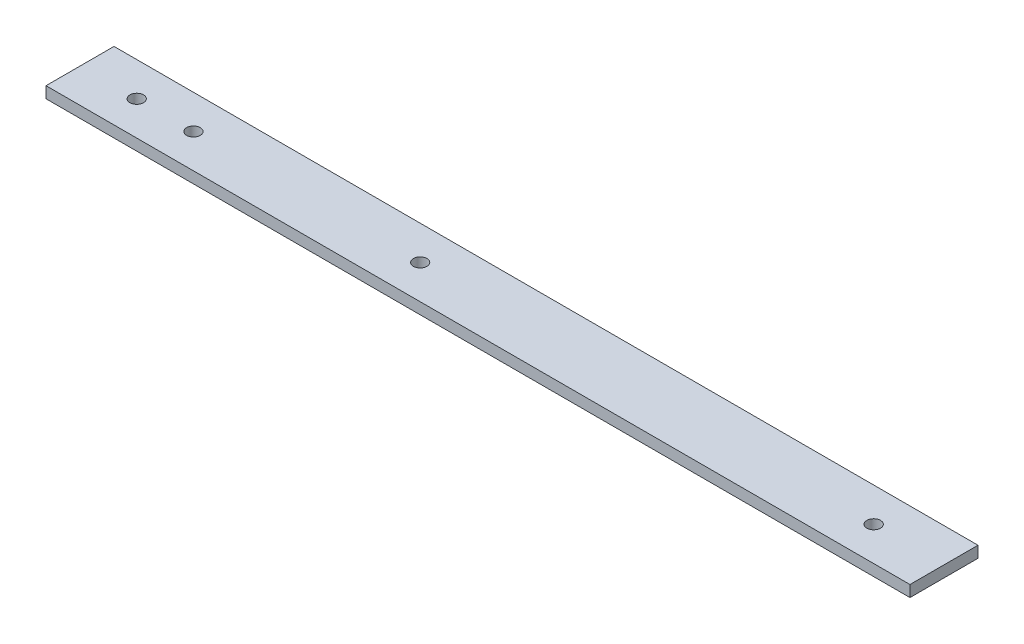
ISO-10303-21;
HEADER;
FILE_DESCRIPTION(('STEP AP214'),'2;1');
FILE_NAME('part.step','',(''),(''),'','','');
FILE_SCHEMA(('AUTOMOTIVE_DESIGN { 1 0 10303 214 1 1 1 1 }'));
ENDSEC;
DATA;
#1=APPLICATION_CONTEXT('core data for automotive mechanical design processes');
#2=APPLICATION_PROTOCOL_DEFINITION('international standard','automotive_design',2000,#1);
#3=PRODUCT_CONTEXT('',#1,'mechanical');
#4=PRODUCT('Part','Part','',(#3));
#5=PRODUCT_RELATED_PRODUCT_CATEGORY('part','',(#4));
#6=PRODUCT_DEFINITION_FORMATION('','',#4);
#7=PRODUCT_DEFINITION_CONTEXT('part definition',#1,'design');
#8=PRODUCT_DEFINITION('design','',#6,#7);
#9=PRODUCT_DEFINITION_SHAPE('','',#8);
#10=(LENGTH_UNIT() NAMED_UNIT(*) SI_UNIT(.MILLI.,.METRE.));
#11=(NAMED_UNIT(*) PLANE_ANGLE_UNIT() SI_UNIT($,.RADIAN.));
#12=(NAMED_UNIT(*) SI_UNIT($,.STERADIAN.) SOLID_ANGLE_UNIT());
#13=UNCERTAINTY_MEASURE_WITH_UNIT(LENGTH_MEASURE(1.E-05),#10,'distance_accuracy_value','');
#14=(GEOMETRIC_REPRESENTATION_CONTEXT(3) GLOBAL_UNCERTAINTY_ASSIGNED_CONTEXT((#13)) GLOBAL_UNIT_ASSIGNED_CONTEXT((#10,
#11,#12)) REPRESENTATION_CONTEXT('',''));
#15=CARTESIAN_POINT('',(0.,0.,0.));
#16=DIRECTION('',(0.,0.,1.));
#17=DIRECTION('',(1.,0.,0.));
#18=AXIS2_PLACEMENT_3D('',#15,#16,#17);
#19=CARTESIAN_POINT('',(0.,5.,0.));
#20=DIRECTION('',(0.,-1.,0.));
#21=DIRECTION('',(0.,0.,-1.));
#22=AXIS2_PLACEMENT_3D('',#19,#20,#21);
#23=PLANE('',#22);
#24=CARTESIAN_POINT('',(150.,5.,-15.));
#25=DIRECTION('',(0.,1.,0.));
#26=DIRECTION('',(0.,0.,1.));
#27=AXIS2_PLACEMENT_3D('',#24,#25,#26);
#28=CIRCLE('',#27,2.99999999999999);
#29=CARTESIAN_POINT('',(150.,5.,-12.));
#30=VERTEX_POINT('',#29);
#31=EDGE_CURVE('E121',#30,#30,#28,.T.);
#32=ORIENTED_EDGE('',*,*,#31,.F.);
#33=EDGE_LOOP('',(#32));
#34=FACE_BOUND('',#33,.T.);
#35=CARTESIAN_POINT('',(25.,5.,-15.));
#36=DIRECTION('',(0.,1.,0.));
#37=DIRECTION('',(0.,0.,1.));
#38=AXIS2_PLACEMENT_3D('',#35,#36,#37);
#39=CIRCLE('',#38,3.);
#40=CARTESIAN_POINT('',(25.,5.,-12.));
#41=VERTEX_POINT('',#40);
#42=EDGE_CURVE('E100',#41,#41,#39,.T.);
#43=ORIENTED_EDGE('',*,*,#42,.F.);
#44=EDGE_LOOP('',(#43));
#45=FACE_BOUND('',#44,.T.);
#46=DIRECTION('',(0.,0.,1.));
#47=VECTOR('',#46,1.);
#48=CARTESIAN_POINT('',(0.,5.,0.));
#49=LINE('',#48,#47);
#50=CARTESIAN_POINT('',(0.,5.,-30.));
#51=VERTEX_POINT('',#50);
#52=CARTESIAN_POINT('',(0.,5.,0.));
#53=VERTEX_POINT('',#52);
#54=EDGE_CURVE('E85',#51,#53,#49,.T.);
#55=ORIENTED_EDGE('',*,*,#54,.T.);
#56=DIRECTION('',(1.,0.,0.));
#57=VECTOR('',#56,1.);
#58=CARTESIAN_POINT('',(0.,5.,0.));
#59=LINE('',#58,#57);
#60=CARTESIAN_POINT('',(381.,5.,0.));
#61=VERTEX_POINT('',#60);
#62=EDGE_CURVE('E80',#53,#61,#59,.T.);
#63=ORIENTED_EDGE('',*,*,#62,.T.);
#64=DIRECTION('',(0.,0.,-1.));
#65=VECTOR('',#64,1.);
#66=CARTESIAN_POINT('',(381.,5.,0.));
#67=LINE('',#66,#65);
#68=CARTESIAN_POINT('',(381.,5.,-30.));
#69=VERTEX_POINT('',#68);
#70=EDGE_CURVE('E83',#61,#69,#67,.T.);
#71=ORIENTED_EDGE('',*,*,#70,.T.);
#72=DIRECTION('',(-1.,0.,0.));
#73=VECTOR('',#72,1.);
#74=CARTESIAN_POINT('',(0.,5.,-30.));
#75=LINE('',#74,#73);
#76=EDGE_CURVE('E50',#69,#51,#75,.T.);
#77=ORIENTED_EDGE('',*,*,#76,.T.);
#78=EDGE_LOOP('',(#55,#63,#71,#77));
#79=FACE_BOUND('',#78,.T.);
#80=CARTESIAN_POINT('',(50.,5.,-15.));
#81=DIRECTION('',(0.,1.,0.));
#82=DIRECTION('',(0.,0.,1.));
#83=AXIS2_PLACEMENT_3D('',#80,#81,#82);
#84=CIRCLE('',#83,3.);
#85=CARTESIAN_POINT('',(50.,5.,-12.));
#86=VERTEX_POINT('',#85);
#87=EDGE_CURVE('E115',#86,#86,#84,.T.);
#88=ORIENTED_EDGE('',*,*,#87,.F.);
#89=EDGE_LOOP('',(#88));
#90=FACE_BOUND('',#89,.T.);
#91=CARTESIAN_POINT('',(350.,5.,-15.));
#92=DIRECTION('',(0.,1.,0.));
#93=DIRECTION('',(0.,0.,1.));
#94=AXIS2_PLACEMENT_3D('',#91,#92,#93);
#95=CIRCLE('',#94,2.99999999999999);
#96=CARTESIAN_POINT('',(350.,5.,-12.));
#97=VERTEX_POINT('',#96);
#98=EDGE_CURVE('E127',#97,#97,#95,.T.);
#99=ORIENTED_EDGE('',*,*,#98,.F.);
#100=EDGE_LOOP('',(#99));
#101=FACE_BOUND('',#100,.T.);
#102=ADVANCED_FACE('F33',(#34,#45,#79,#90,#101),#23,.F.);
#103=CARTESIAN_POINT('',(0.,0.,0.));
#104=DIRECTION('',(0.,-1.,0.));
#105=DIRECTION('',(0.,0.,-1.));
#106=AXIS2_PLACEMENT_3D('',#103,#104,#105);
#107=PLANE('',#106);
#108=CARTESIAN_POINT('',(150.,0.,-15.));
#109=DIRECTION('',(0.,1.,0.));
#110=DIRECTION('',(0.,0.,1.));
#111=AXIS2_PLACEMENT_3D('',#108,#109,#110);
#112=CIRCLE('',#111,2.99999999999999);
#113=CARTESIAN_POINT('',(150.,0.,-12.));
#114=VERTEX_POINT('',#113);
#115=EDGE_CURVE('E124',#114,#114,#112,.T.);
#116=ORIENTED_EDGE('',*,*,#115,.T.);
#117=EDGE_LOOP('',(#116));
#118=FACE_BOUND('',#117,.T.);
#119=CARTESIAN_POINT('',(25.,0.,-15.));
#120=DIRECTION('',(0.,1.,0.));
#121=DIRECTION('',(0.,0.,1.));
#122=AXIS2_PLACEMENT_3D('',#119,#120,#121);
#123=CIRCLE('',#122,3.);
#124=CARTESIAN_POINT('',(25.,0.,-12.));
#125=VERTEX_POINT('',#124);
#126=EDGE_CURVE('E112',#125,#125,#123,.T.);
#127=ORIENTED_EDGE('',*,*,#126,.T.);
#128=EDGE_LOOP('',(#127));
#129=FACE_BOUND('',#128,.T.);
#130=DIRECTION('',(0.,0.,1.));
#131=VECTOR('',#130,1.);
#132=CARTESIAN_POINT('',(0.,0.,0.));
#133=LINE('',#132,#131);
#134=CARTESIAN_POINT('',(0.,0.,-30.));
#135=VERTEX_POINT('',#134);
#136=CARTESIAN_POINT('',(0.,0.,0.));
#137=VERTEX_POINT('',#136);
#138=EDGE_CURVE('E97',#135,#137,#133,.T.);
#139=ORIENTED_EDGE('',*,*,#138,.F.);
#140=DIRECTION('',(-1.,0.,0.));
#141=VECTOR('',#140,1.);
#142=CARTESIAN_POINT('',(0.,0.,-30.));
#143=LINE('',#142,#141);
#144=CARTESIAN_POINT('',(381.,0.,-30.));
#145=VERTEX_POINT('',#144);
#146=EDGE_CURVE('E73',#145,#135,#143,.T.);
#147=ORIENTED_EDGE('',*,*,#146,.F.);
#148=DIRECTION('',(0.,0.,-1.));
#149=VECTOR('',#148,1.);
#150=CARTESIAN_POINT('',(381.,0.,0.));
#151=LINE('',#150,#149);
#152=CARTESIAN_POINT('',(381.,0.,0.));
#153=VERTEX_POINT('',#152);
#154=EDGE_CURVE('E67',#153,#145,#151,.T.);
#155=ORIENTED_EDGE('',*,*,#154,.F.);
#156=DIRECTION('',(1.,0.,0.));
#157=VECTOR('',#156,1.);
#158=CARTESIAN_POINT('',(0.,0.,0.));
#159=LINE('',#158,#157);
#160=EDGE_CURVE('E89',#137,#153,#159,.T.);
#161=ORIENTED_EDGE('',*,*,#160,.F.);
#162=EDGE_LOOP('',(#139,#147,#155,#161));
#163=FACE_BOUND('',#162,.T.);
#164=CARTESIAN_POINT('',(50.,0.,-15.));
#165=DIRECTION('',(0.,1.,0.));
#166=DIRECTION('',(0.,0.,1.));
#167=AXIS2_PLACEMENT_3D('',#164,#165,#166);
#168=CIRCLE('',#167,3.);
#169=CARTESIAN_POINT('',(50.,0.,-12.));
#170=VERTEX_POINT('',#169);
#171=EDGE_CURVE('E118',#170,#170,#168,.T.);
#172=ORIENTED_EDGE('',*,*,#171,.T.);
#173=EDGE_LOOP('',(#172));
#174=FACE_BOUND('',#173,.T.);
#175=CARTESIAN_POINT('',(350.,0.,-15.));
#176=DIRECTION('',(0.,1.,0.));
#177=DIRECTION('',(0.,0.,1.));
#178=AXIS2_PLACEMENT_3D('',#175,#176,#177);
#179=CIRCLE('',#178,2.99999999999999);
#180=CARTESIAN_POINT('',(350.,0.,-12.));
#181=VERTEX_POINT('',#180);
#182=EDGE_CURVE('E130',#181,#181,#179,.T.);
#183=ORIENTED_EDGE('',*,*,#182,.T.);
#184=EDGE_LOOP('',(#183));
#185=FACE_BOUND('',#184,.T.);
#186=ADVANCED_FACE('F108',(#118,#129,#163,#174,#185),#107,.T.);
#187=CARTESIAN_POINT('',(0.,5.,0.));
#188=DIRECTION('',(1.,0.,0.));
#189=DIRECTION('',(0.,0.,-1.));
#190=AXIS2_PLACEMENT_3D('',#187,#188,#189);
#191=PLANE('',#190);
#192=ORIENTED_EDGE('',*,*,#138,.T.);
#193=DIRECTION('',(0.,-1.,0.));
#194=VECTOR('',#193,1.);
#195=CARTESIAN_POINT('',(0.,5.,0.));
#196=LINE('',#195,#194);
#197=EDGE_CURVE('E11',#53,#137,#196,.T.);
#198=ORIENTED_EDGE('',*,*,#197,.F.);
#199=ORIENTED_EDGE('',*,*,#54,.F.);
#200=DIRECTION('',(0.,-1.,0.));
#201=VECTOR('',#200,1.);
#202=CARTESIAN_POINT('',(0.,5.,-30.));
#203=LINE('',#202,#201);
#204=EDGE_CURVE('E93',#51,#135,#203,.T.);
#205=ORIENTED_EDGE('',*,*,#204,.T.);
#206=EDGE_LOOP('',(#192,#198,#199,#205));
#207=FACE_BOUND('',#206,.T.);
#208=ADVANCED_FACE('F35',(#207),#191,.F.);
#209=CARTESIAN_POINT('',(0.,5.,0.));
#210=DIRECTION('',(0.,0.,-1.));
#211=DIRECTION('',(-1.,0.,0.));
#212=AXIS2_PLACEMENT_3D('',#209,#210,#211);
#213=PLANE('',#212);
#214=ORIENTED_EDGE('',*,*,#160,.T.);
#215=DIRECTION('',(0.,-1.,0.));
#216=VECTOR('',#215,1.);
#217=CARTESIAN_POINT('',(381.,5.,0.));
#218=LINE('',#217,#216);
#219=EDGE_CURVE('E42',#61,#153,#218,.T.);
#220=ORIENTED_EDGE('',*,*,#219,.F.);
#221=ORIENTED_EDGE('',*,*,#62,.F.);
#222=ORIENTED_EDGE('',*,*,#197,.T.);
#223=EDGE_LOOP('',(#214,#220,#221,#222));
#224=FACE_BOUND('',#223,.T.);
#225=ADVANCED_FACE('F88',(#224),#213,.F.);
#226=CARTESIAN_POINT('',(381.,5.,0.));
#227=DIRECTION('',(-1.,0.,0.));
#228=DIRECTION('',(0.,0.,1.));
#229=AXIS2_PLACEMENT_3D('',#226,#227,#228);
#230=PLANE('',#229);
#231=ORIENTED_EDGE('',*,*,#154,.T.);
#232=DIRECTION('',(0.,-1.,0.));
#233=VECTOR('',#232,1.);
#234=CARTESIAN_POINT('',(381.,5.,-30.));
#235=LINE('',#234,#233);
#236=EDGE_CURVE('E90',#69,#145,#235,.T.);
#237=ORIENTED_EDGE('',*,*,#236,.F.);
#238=ORIENTED_EDGE('',*,*,#70,.F.);
#239=ORIENTED_EDGE('',*,*,#219,.T.);
#240=EDGE_LOOP('',(#231,#237,#238,#239));
#241=FACE_BOUND('',#240,.T.);
#242=ADVANCED_FACE('F91',(#241),#230,.F.);
#243=CARTESIAN_POINT('',(0.,5.,-30.));
#244=DIRECTION('',(0.,0.,1.));
#245=DIRECTION('',(1.,0.,0.));
#246=AXIS2_PLACEMENT_3D('',#243,#244,#245);
#247=PLANE('',#246);
#248=ORIENTED_EDGE('',*,*,#146,.T.);
#249=ORIENTED_EDGE('',*,*,#204,.F.);
#250=ORIENTED_EDGE('',*,*,#76,.F.);
#251=ORIENTED_EDGE('',*,*,#236,.T.);
#252=EDGE_LOOP('',(#248,#249,#250,#251));
#253=FACE_BOUND('',#252,.T.);
#254=ADVANCED_FACE('F105',(#253),#247,.F.);
#255=CARTESIAN_POINT('',(25.,5.,-15.));
#256=DIRECTION('',(0.,-1.,0.));
#257=DIRECTION('',(0.,0.,-1.));
#258=AXIS2_PLACEMENT_3D('',#255,#256,#257);
#259=CYLINDRICAL_SURFACE('',#258,3.);
#260=ORIENTED_EDGE('',*,*,#42,.T.);
#261=EDGE_LOOP('',(#260));
#262=FACE_BOUND('',#261,.T.);
#263=ORIENTED_EDGE('',*,*,#126,.F.);
#264=EDGE_LOOP('',(#263));
#265=FACE_BOUND('',#264,.T.);
#266=ADVANCED_FACE('F150',(#262,#265),#259,.F.);
#267=CARTESIAN_POINT('',(50.,5.,-15.));
#268=DIRECTION('',(0.,-1.,0.));
#269=DIRECTION('',(0.,0.,-1.));
#270=AXIS2_PLACEMENT_3D('',#267,#268,#269);
#271=CYLINDRICAL_SURFACE('',#270,3.);
#272=ORIENTED_EDGE('',*,*,#87,.T.);
#273=EDGE_LOOP('',(#272));
#274=FACE_BOUND('',#273,.T.);
#275=ORIENTED_EDGE('',*,*,#171,.F.);
#276=EDGE_LOOP('',(#275));
#277=FACE_BOUND('',#276,.T.);
#278=ADVANCED_FACE('F196',(#274,#277),#271,.F.);
#279=CARTESIAN_POINT('',(150.,5.,-15.));
#280=DIRECTION('',(0.,-1.,0.));
#281=DIRECTION('',(0.,0.,-1.));
#282=AXIS2_PLACEMENT_3D('',#279,#280,#281);
#283=CYLINDRICAL_SURFACE('',#282,2.99999999999999);
#284=ORIENTED_EDGE('',*,*,#31,.T.);
#285=EDGE_LOOP('',(#284));
#286=FACE_BOUND('',#285,.T.);
#287=ORIENTED_EDGE('',*,*,#115,.F.);
#288=EDGE_LOOP('',(#287));
#289=FACE_BOUND('',#288,.T.);
#290=ADVANCED_FACE('F204',(#286,#289),#283,.F.);
#291=CARTESIAN_POINT('',(350.,5.,-15.));
#292=DIRECTION('',(0.,-1.,0.));
#293=DIRECTION('',(0.,0.,-1.));
#294=AXIS2_PLACEMENT_3D('',#291,#292,#293);
#295=CYLINDRICAL_SURFACE('',#294,2.99999999999999);
#296=ORIENTED_EDGE('',*,*,#98,.T.);
#297=EDGE_LOOP('',(#296));
#298=FACE_BOUND('',#297,.T.);
#299=ORIENTED_EDGE('',*,*,#182,.F.);
#300=EDGE_LOOP('',(#299));
#301=FACE_BOUND('',#300,.T.);
#302=ADVANCED_FACE('F136',(#298,#301),#295,.F.);
#303=CLOSED_SHELL('',(#102,#186,#208,#225,#242,#254,#266,#278,#290,#302));
#304=MANIFOLD_SOLID_BREP('B2',#303);
#305=ADVANCED_BREP_SHAPE_REPRESENTATION('',(#18,#304),#14);
#306=SHAPE_DEFINITION_REPRESENTATION(#9,#305);
ENDSEC;
END-ISO-10303-21;
